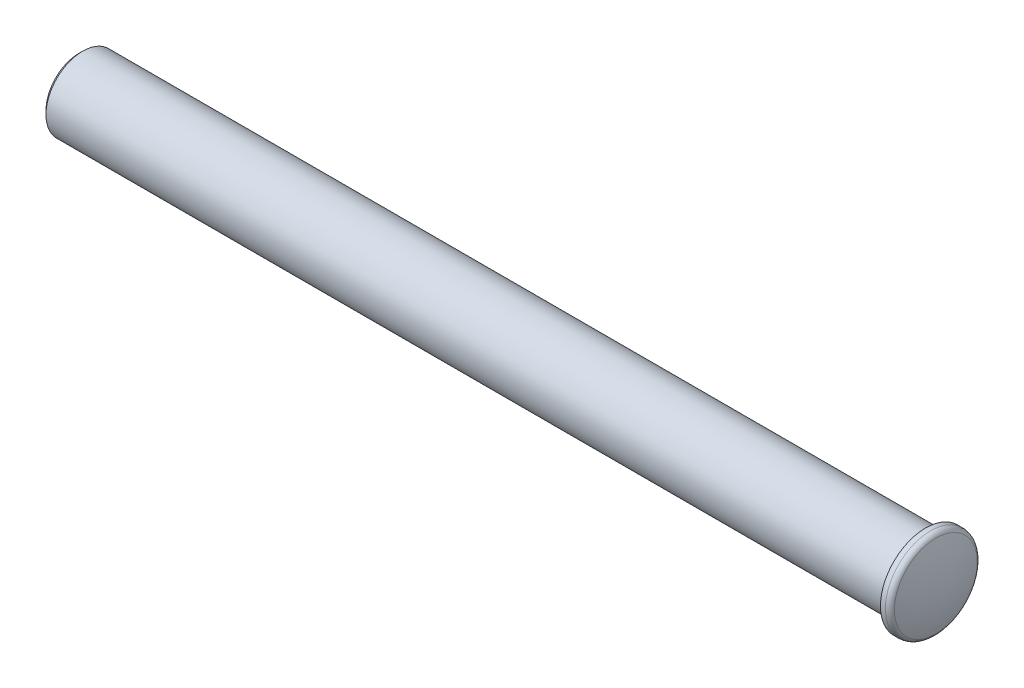
ISO-10303-21;
HEADER;
FILE_DESCRIPTION(('STEP AP214'),'2;1');
FILE_NAME('part.step','',(''),(''),'','','');
FILE_SCHEMA(('AUTOMOTIVE_DESIGN { 1 0 10303 214 1 1 1 1 }'));
ENDSEC;
DATA;
#1=APPLICATION_CONTEXT('core data for automotive mechanical design processes');
#2=APPLICATION_PROTOCOL_DEFINITION('international standard','automotive_design',2000,#1);
#3=PRODUCT_CONTEXT('',#1,'mechanical');
#4=PRODUCT('Part','Part','',(#3));
#5=PRODUCT_RELATED_PRODUCT_CATEGORY('part','',(#4));
#6=PRODUCT_DEFINITION_FORMATION('','',#4);
#7=PRODUCT_DEFINITION_CONTEXT('part definition',#1,'design');
#8=PRODUCT_DEFINITION('design','',#6,#7);
#9=PRODUCT_DEFINITION_SHAPE('','',#8);
#10=(LENGTH_UNIT() NAMED_UNIT(*) SI_UNIT(.MILLI.,.METRE.));
#11=(NAMED_UNIT(*) PLANE_ANGLE_UNIT() SI_UNIT($,.RADIAN.));
#12=(NAMED_UNIT(*) SI_UNIT($,.STERADIAN.) SOLID_ANGLE_UNIT());
#13=UNCERTAINTY_MEASURE_WITH_UNIT(LENGTH_MEASURE(1.E-05),#10,'distance_accuracy_value','');
#14=(GEOMETRIC_REPRESENTATION_CONTEXT(3) GLOBAL_UNCERTAINTY_ASSIGNED_CONTEXT((#13)) GLOBAL_UNIT_ASSIGNED_CONTEXT((#10,
#11,#12)) REPRESENTATION_CONTEXT('',''));
#15=CARTESIAN_POINT('',(0.,0.,0.));
#16=DIRECTION('',(0.,0.,1.));
#17=DIRECTION('',(1.,0.,0.));
#18=AXIS2_PLACEMENT_3D('',#15,#16,#17);
#19=CARTESIAN_POINT('',(19.05,0.,0.));
#20=DIRECTION('',(-1.,0.,0.));
#21=DIRECTION('',(0.,0.,1.));
#22=AXIS2_PLACEMENT_3D('',#19,#20,#21);
#23=CYLINDRICAL_SURFACE('',#22,1.651);
#24=CARTESIAN_POINT('',(-18.8849,0.,0.));
#25=DIRECTION('',(1.,0.,0.));
#26=DIRECTION('',(0.,0.,-1.));
#27=AXIS2_PLACEMENT_3D('',#24,#25,#26);
#28=CIRCLE('',#27,1.651);
#29=CARTESIAN_POINT('',(-18.8849,0.,1.651));
#30=VERTEX_POINT('',#29);
#31=EDGE_CURVE('E46',#30,#30,#28,.T.);
#32=CARTESIAN_POINT('',(19.05,0.,0.));
#33=DIRECTION('',(1.,0.,0.));
#34=DIRECTION('',(0.,0.,-1.));
#35=AXIS2_PLACEMENT_3D('',#32,#33,#34);
#36=CIRCLE('',#35,1.651);
#37=CARTESIAN_POINT('',(19.05,0.,1.651));
#38=VERTEX_POINT('',#37);
#39=EDGE_CURVE('E50',#38,#38,#36,.T.);
#40=CARTESIAN_POINT('',(-18.8849,0.,1.651));
#41=CARTESIAN_POINT('',(-18.4897447916666,0.,1.651));
#42=CARTESIAN_POINT('',(-18.0945895833333,0.,1.651));
#43=CARTESIAN_POINT('',(-17.3042791666666,0.,1.651));
#44=CARTESIAN_POINT('',(-16.9091239583333,0.,1.651));
#45=CARTESIAN_POINT('',(-16.1188135416666,0.,1.651));
#46=CARTESIAN_POINT('',(-15.7236583333333,0.,1.651));
#47=CARTESIAN_POINT('',(-14.9333479166666,0.,1.651));
#48=CARTESIAN_POINT('',(-14.5381927083333,0.,1.651));
#49=CARTESIAN_POINT('',(-13.7478822916666,0.,1.651));
#50=CARTESIAN_POINT('',(-13.3527270833333,0.,1.651));
#51=CARTESIAN_POINT('',(-12.5624166666666,0.,1.651));
#52=CARTESIAN_POINT('',(-12.1672614583333,0.,1.651));
#53=CARTESIAN_POINT('',(-11.3769510416666,0.,1.651));
#54=CARTESIAN_POINT('',(-10.9817958333333,0.,1.651));
#55=CARTESIAN_POINT('',(-10.1914854166666,0.,1.651));
#56=CARTESIAN_POINT('',(-9.79633020833331,0.,1.651));
#57=CARTESIAN_POINT('',(-9.00601979166664,0.,1.651));
#58=CARTESIAN_POINT('',(-8.61086458333331,0.,1.651));
#59=CARTESIAN_POINT('',(-7.82055416666664,0.,1.651));
#60=CARTESIAN_POINT('',(-7.42539895833331,0.,1.651));
#61=CARTESIAN_POINT('',(-6.63508854166664,0.,1.651));
#62=CARTESIAN_POINT('',(-6.23993333333331,0.,1.651));
#63=CARTESIAN_POINT('',(-5.44962291666664,0.,1.651));
#64=CARTESIAN_POINT('',(-5.05446770833331,0.,1.651));
#65=CARTESIAN_POINT('',(-4.26415729166664,0.,1.651));
#66=CARTESIAN_POINT('',(-3.86900208333331,0.,1.651));
#67=CARTESIAN_POINT('',(-3.07869166666665,0.,1.651));
#68=CARTESIAN_POINT('',(-2.68353645833331,0.,1.651));
#69=CARTESIAN_POINT('',(-1.89322604166665,0.,1.651));
#70=CARTESIAN_POINT('',(-1.49807083333332,0.,1.651));
#71=CARTESIAN_POINT('',(-0.707760416666648,0.,1.651));
#72=CARTESIAN_POINT('',(-0.312605208333315,0.,1.651));
#73=CARTESIAN_POINT('',(0.477705208333351,0.,1.651));
#74=CARTESIAN_POINT('',(0.872860416666684,0.,1.651));
#75=CARTESIAN_POINT('',(1.66317083333335,0.,1.651));
#76=CARTESIAN_POINT('',(2.05832604166668,0.,1.651));
#77=CARTESIAN_POINT('',(2.84863645833335,0.,1.651));
#78=CARTESIAN_POINT('',(3.24379166666668,0.,1.651));
#79=CARTESIAN_POINT('',(4.03410208333335,0.,1.651));
#80=CARTESIAN_POINT('',(4.42925729166668,0.,1.651));
#81=CARTESIAN_POINT('',(5.21956770833335,0.,1.651));
#82=CARTESIAN_POINT('',(5.61472291666668,0.,1.651));
#83=CARTESIAN_POINT('',(6.40503333333334,0.,1.651));
#84=CARTESIAN_POINT('',(6.80018854166668,0.,1.651));
#85=CARTESIAN_POINT('',(7.59049895833334,0.,1.651));
#86=CARTESIAN_POINT('',(7.98565416666668,0.,1.651));
#87=CARTESIAN_POINT('',(8.77596458333334,0.,1.651));
#88=CARTESIAN_POINT('',(9.17111979166667,0.,1.651));
#89=CARTESIAN_POINT('',(9.96143020833334,0.,1.651));
#90=CARTESIAN_POINT('',(10.3565854166667,0.,1.651));
#91=CARTESIAN_POINT('',(11.1468958333333,0.,1.651));
#92=CARTESIAN_POINT('',(11.5420510416667,0.,1.651));
#93=CARTESIAN_POINT('',(12.3323614583333,0.,1.651));
#94=CARTESIAN_POINT('',(12.7275166666667,0.,1.651));
#95=CARTESIAN_POINT('',(13.5178270833333,0.,1.651));
#96=CARTESIAN_POINT('',(13.9129822916667,0.,1.651));
#97=CARTESIAN_POINT('',(14.7032927083333,0.,1.651));
#98=CARTESIAN_POINT('',(15.0984479166667,0.,1.651));
#99=CARTESIAN_POINT('',(15.8887583333333,0.,1.651));
#100=CARTESIAN_POINT('',(16.2839135416667,0.,1.651));
#101=CARTESIAN_POINT('',(17.0742239583333,0.,1.651));
#102=CARTESIAN_POINT('',(17.4693791666667,0.,1.651));
#103=CARTESIAN_POINT('',(18.2596895833333,0.,1.651));
#104=CARTESIAN_POINT('',(18.6548447916667,0.,1.651));
#105=CARTESIAN_POINT('',(19.05,0.,1.651));
#106=B_SPLINE_CURVE_WITH_KNOTS('',3,(#40,#41,#42,#43,#44,#45,#46,#47,#48,#49,#50,#51,#52,#53,
#54,#55,#56,#57,#58,#59,#60,#61,#62,#63,#64,#65,#66,#67,#68,#69,#70,#71,#72,#73,#74,#75,#76,#77,
#78,#79,#80,#81,#82,#83,#84,#85,#86,#87,#88,#89,#90,#91,#92,#93,#94,#95,#96,#97,#98,#99,#100,
#101,#102,#103,#104,#105),.UNSPECIFIED.,.F.,.F.,(4,2,2,2,2,2,2,2,2,2,2,2,2,2,2,2,2,2,2,2,2,2,2,
2,2,2,2,2,2,2,2,2,4),(0.,1.185465625,2.37093125,3.556396875,4.7418625,5.92732812499999,
7.11279374999999,8.29825937499999,9.48372499999999,10.669190625,11.85465625,13.040121875,
14.2255875,15.411053125,16.59651875,17.781984375,18.96745,20.152915625,21.33838125,22.523846875,
23.7093125,24.894778125,26.08024375,27.265709375,28.451175,29.636640625,30.82210625,
32.007571875,33.1930375,34.378503125,35.56396875,36.749434375,37.9349),.UNSPECIFIED.);
#107=EDGE_CURVE('BSEAM39',#30,#38,#106,.T.);
#108=ORIENTED_EDGE('',*,*,#31,.T.);
#109=ORIENTED_EDGE('',*,*,#39,.F.);
#110=ORIENTED_EDGE('',*,*,#107,.T.);
#111=ORIENTED_EDGE('',*,*,#107,.F.);
#112=EDGE_LOOP('',(#108,#110,#109,#111));
#113=FACE_BOUND('',#112,.T.);
#114=ADVANCED_FACE('F39',(#113),#23,.T.);
#115=CARTESIAN_POINT('',(-19.05,0.,0.));
#116=DIRECTION('',(1.,0.,0.));
#117=DIRECTION('',(0.,0.,-1.));
#118=AXIS2_PLACEMENT_3D('',#115,#116,#117);
#119=PLANE('',#118);
#120=CARTESIAN_POINT('',(-19.05,0.,0.));
#121=DIRECTION('',(1.,0.,0.));
#122=DIRECTION('',(0.,0.,-1.));
#123=AXIS2_PLACEMENT_3D('',#120,#121,#122);
#124=CIRCLE('',#123,1.48589999999997);
#125=CARTESIAN_POINT('',(-19.05,0.,-1.48589999999997));
#126=VERTEX_POINT('',#125);
#127=EDGE_CURVE('E10',#126,#126,#124,.F.);
#128=ORIENTED_EDGE('',*,*,#127,.T.);
#129=EDGE_LOOP('',(#128));
#130=FACE_BOUND('',#129,.T.);
#131=ADVANCED_FACE('F82',(#130),#119,.F.);
#132=CARTESIAN_POINT('',(19.05,0.,0.));
#133=DIRECTION('',(1.,0.,0.));
#134=DIRECTION('',(0.,1.,0.));
#135=AXIS2_PLACEMENT_3D('',#132,#133,#134);
#136=CYLINDRICAL_SURFACE('',#135,2.032);
#137=CARTESIAN_POINT('',(19.2728553601746,0.,0.));
#138=DIRECTION('',(1.,0.,0.));
#139=DIRECTION('',(0.,1.,0.));
#140=AXIS2_PLACEMENT_3D('',#137,#138,#139);
#141=CIRCLE('',#140,2.032);
#142=CARTESIAN_POINT('',(19.2728553601746,2.032,0.));
#143=VERTEX_POINT('',#142);
#144=EDGE_CURVE('E54',#143,#143,#141,.T.);
#145=ORIENTED_EDGE('',*,*,#144,.F.);
#146=EDGE_LOOP('',(#145));
#147=FACE_BOUND('',#146,.T.);
#148=CARTESIAN_POINT('',(19.05,0.,0.));
#149=DIRECTION('',(1.,0.,0.));
#150=DIRECTION('',(0.,1.,0.));
#151=AXIS2_PLACEMENT_3D('',#148,#149,#150);
#152=CIRCLE('',#151,2.03200000000001);
#153=CARTESIAN_POINT('',(19.05,2.03200000000001,0.));
#154=VERTEX_POINT('',#153);
#155=EDGE_CURVE('E62',#154,#154,#152,.T.);
#156=ORIENTED_EDGE('',*,*,#155,.T.);
#157=EDGE_LOOP('',(#156));
#158=FACE_BOUND('',#157,.T.);
#159=ADVANCED_FACE('F66',(#147,#158),#136,.T.);
#160=CARTESIAN_POINT('',(19.2728553601746,0.,0.));
#161=DIRECTION('',(1.,0.,0.));
#162=DIRECTION('',(0.,1.,0.));
#163=AXIS2_PLACEMENT_3D('',#160,#161,#162);
#164=TOROIDAL_SURFACE('',#163,1.778,0.254000000000004);
#165=CARTESIAN_POINT('',(19.5112149312857,0.,0.));
#166=DIRECTION('',(1.,0.,0.));
#167=DIRECTION('',(0.,1.,0.));
#168=AXIS2_PLACEMENT_3D('',#165,#166,#167);
#169=CIRCLE('',#168,1.86575371707076);
#170=CARTESIAN_POINT('',(19.5112149312857,1.86575371707076,0.));
#171=VERTEX_POINT('',#170);
#172=EDGE_CURVE('E59',#171,#171,#169,.T.);
#173=ORIENTED_EDGE('',*,*,#172,.F.);
#174=EDGE_LOOP('',(#173));
#175=FACE_BOUND('',#174,.T.);
#176=ORIENTED_EDGE('',*,*,#144,.T.);
#177=EDGE_LOOP('',(#176));
#178=FACE_BOUND('',#177,.T.);
#179=ADVANCED_FACE('F78',(#175,#178),#164,.T.);
#180=CARTESIAN_POINT('',(14.4433925,0.,0.));
#181=DIRECTION('',(1.,0.,0.));
#182=DIRECTION('',(0.,1.,0.));
#183=AXIS2_PLACEMENT_3D('',#180,#181,#182);
#184=SPHERICAL_SURFACE('',#183,5.40035750000003);
#185=ORIENTED_EDGE('',*,*,#172,.T.);
#186=EDGE_LOOP('',(#185));
#187=FACE_BOUND('',#186,.T.);
#188=ADVANCED_FACE('F70',(#187),#184,.T.);
#189=CARTESIAN_POINT('',(19.05,2.03200000000001,0.));
#190=DIRECTION('',(-1.,0.,0.));
#191=DIRECTION('',(0.,-1.,0.));
#192=AXIS2_PLACEMENT_3D('',#189,#190,#191);
#193=PLANE('',#192);
#194=ORIENTED_EDGE('',*,*,#39,.T.);
#195=EDGE_LOOP('',(#194));
#196=FACE_BOUND('',#195,.T.);
#197=ORIENTED_EDGE('',*,*,#155,.F.);
#198=EDGE_LOOP('',(#197));
#199=FACE_BOUND('',#198,.T.);
#200=ADVANCED_FACE('F68',(#196,#199),#193,.T.);
#201=CARTESIAN_POINT('',(-18.8849,0.,0.));
#202=DIRECTION('',(1.,0.,0.));
#203=DIRECTION('',(0.,0.,-1.));
#204=AXIS2_PLACEMENT_3D('',#201,#202,#203);
#205=CONICAL_SURFACE('',#204,1.651,0.785398163397429);
#206=ORIENTED_EDGE('',*,*,#127,.F.);
#207=EDGE_LOOP('',(#206));
#208=FACE_BOUND('',#207,.T.);
#209=ORIENTED_EDGE('',*,*,#31,.F.);
#210=EDGE_LOOP('',(#209));
#211=FACE_BOUND('',#210,.T.);
#212=ADVANCED_FACE('F41',(#208,#211),#205,.T.);
#213=CLOSED_SHELL('',(#114,#131,#159,#179,#188,#200,#212));
#214=MANIFOLD_SOLID_BREP('B2',#213);
#215=ADVANCED_BREP_SHAPE_REPRESENTATION('',(#18,#214),#14);
#216=SHAPE_DEFINITION_REPRESENTATION(#9,#215);
ENDSEC;
END-ISO-10303-21;
